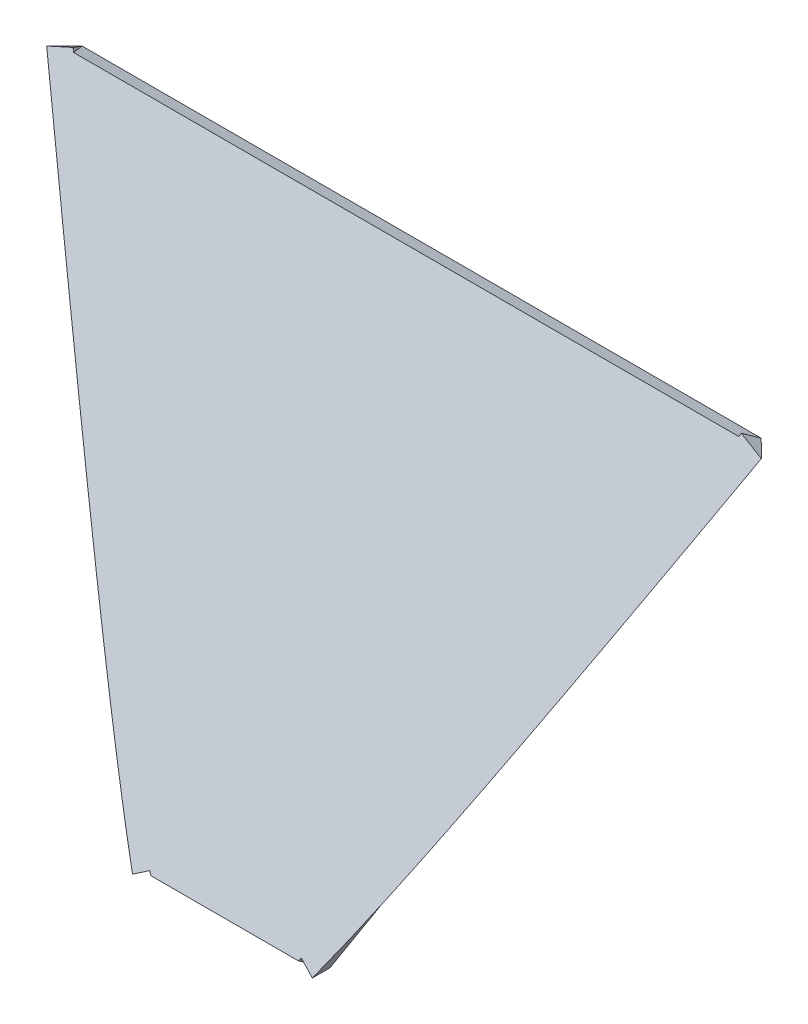
ISO-10303-21;
HEADER;
FILE_DESCRIPTION(('STEP AP214'),'2;1');
FILE_NAME('part.step','',(''),(''),'','','');
FILE_SCHEMA(('AUTOMOTIVE_DESIGN { 1 0 10303 214 1 1 1 1 }'));
ENDSEC;
DATA;
#1=APPLICATION_CONTEXT('core data for automotive mechanical design processes');
#2=APPLICATION_PROTOCOL_DEFINITION('international standard','automotive_design',2000,#1);
#3=PRODUCT_CONTEXT('',#1,'mechanical');
#4=PRODUCT('Part','Part','',(#3));
#5=PRODUCT_RELATED_PRODUCT_CATEGORY('part','',(#4));
#6=PRODUCT_DEFINITION_FORMATION('','',#4);
#7=PRODUCT_DEFINITION_CONTEXT('part definition',#1,'design');
#8=PRODUCT_DEFINITION('design','',#6,#7);
#9=PRODUCT_DEFINITION_SHAPE('','',#8);
#10=(LENGTH_UNIT() NAMED_UNIT(*) SI_UNIT(.MILLI.,.METRE.));
#11=(NAMED_UNIT(*) PLANE_ANGLE_UNIT() SI_UNIT($,.RADIAN.));
#12=(NAMED_UNIT(*) SI_UNIT($,.STERADIAN.) SOLID_ANGLE_UNIT());
#13=UNCERTAINTY_MEASURE_WITH_UNIT(LENGTH_MEASURE(1.E-05),#10,'distance_accuracy_value','');
#14=(GEOMETRIC_REPRESENTATION_CONTEXT(3) GLOBAL_UNCERTAINTY_ASSIGNED_CONTEXT((#13)) GLOBAL_UNIT_ASSIGNED_CONTEXT((#10,
#11,#12)) REPRESENTATION_CONTEXT('',''));
#15=CARTESIAN_POINT('',(0.,0.,0.));
#16=DIRECTION('',(0.,0.,1.));
#17=DIRECTION('',(1.,0.,0.));
#18=AXIS2_PLACEMENT_3D('',#15,#16,#17);
#19=CARTESIAN_POINT('',(74.944091331686,35.2889154237541,80.7341407062869));
#20=DIRECTION('',(0.,0.345802356485694,0.938307375143637));
#21=DIRECTION('',(0.,-0.938307375143637,0.345802356485694));
#22=AXIS2_PLACEMENT_3D('',#19,#20,#21);
#23=PLANE('',#22);
#24=CARTESIAN_POINT('',(-214.291058699405,361.587206260044,-39.5193294011717));
#25=CARTESIAN_POINT('',(-212.556623059235,362.245134817487,-39.7618013795339));
#26=CARTESIAN_POINT('',(-210.821546542544,362.901575988517,-40.0037251987961));
#27=CARTESIAN_POINT('',(-207.333777138551,364.217638396353,-40.4887448138685));
#28=CARTESIAN_POINT('',(-205.581072154773,364.877231409094,-40.7318302080255));
#29=CARTESIAN_POINT('',(-202.074355503818,366.193368613759,-41.2168773886066));
#30=CARTESIAN_POINT('',(-200.32034383217,366.849912795199,-41.4588391711665));
#31=CARTESIAN_POINT('',(-198.565683167573,367.504926389897,-41.7002368736433));
#32=B_SPLINE_CURVE_WITH_KNOTS('',3,(#24,#25,#26,#27,#28,#29,#30,#31),.UNSPECIFIED.,.F.,.F.,(4,2,
2,4),(0.,5.61242893117131,11.2776841921955,16.942958921563),.UNSPECIFIED.);
#33=CARTESIAN_POINT('',(-214.135561749803,361.646186737307,-39.541065975523));
#34=VERTEX_POINT('',#33);
#35=CARTESIAN_POINT('',(-198.565683191778,367.504926406604,-41.7002368798004));
#36=VERTEX_POINT('',#35);
#37=EDGE_CURVE('E134',#34,#36,#32,.T.);
#38=ORIENTED_EDGE('',*,*,#37,.F.);
#39=CARTESIAN_POINT('',(-34.9249999999667,31.4461867373069,82.1503340245001));
#40=CARTESIAN_POINT('',(-35.8161343980092,32.8686188121335,81.6261130960004));
#41=CARTESIAN_POINT('',(-36.7034870073374,34.2931331759312,81.1011247639269));
#42=CARTESIAN_POINT('',(-38.4711518673886,37.1459958902306,80.0497351282184));
#43=CARTESIAN_POINT('',(-39.351464144602,38.5743442262793,79.5233338299098));
#44=CARTESIAN_POINT('',(-41.1054973785298,41.4344231240176,78.4692847530585));
#45=CARTESIAN_POINT('',(-41.9792189356077,42.8661533616517,77.9416370939427));
#46=CARTESIAN_POINT('',(-43.7206176176778,45.7328472102319,76.885150153285));
#47=CARTESIAN_POINT('',(-44.5882947362752,47.1678108245965,76.3563108704833));
#48=CARTESIAN_POINT('',(-47.1828464425876,51.4770496144419,74.7681906364715));
#49=CARTESIAN_POINT('',(-48.9013106548347,54.3557858492935,73.707265613304));
#50=CARTESIAN_POINT('',(-52.318792562241,60.1233690543115,71.5816893721312));
#51=CARTESIAN_POINT('',(-54.0178103715098,63.0122159650194,70.5170381760386));
#52=CARTESIAN_POINT('',(-57.3985674951559,68.7980390436897,68.3847398398913));
#53=CARTESIAN_POINT('',(-59.0803102107533,71.695013462703,67.3170933443917));
#54=CARTESIAN_POINT('',(-62.4289971927276,77.4965454590095,65.1790056679063));
#55=CARTESIAN_POINT('',(-64.0959411943528,80.401103170771,64.1085644373639));
#56=CARTESIAN_POINT('',(-67.4168031450357,86.2168134329279,61.9652515245947));
#57=CARTESIAN_POINT('',(-69.0707209238514,89.1279660688754,60.8923798108388));
#58=CARTESIAN_POINT('',(-72.3670234736668,94.9560167400796,58.7445189827046));
#59=CARTESIAN_POINT('',(-74.0094082294622,97.8729147829041,57.6695298655373));
#60=CARTESIAN_POINT('',(-77.8289777223569,104.683609315012,55.1595269806653));
#61=CARTESIAN_POINT('',(-80.0021898713019,108.579367187927,53.7237903676547));
#62=CARTESIAN_POINT('',(-84.3329978142745,116.37846520867,50.8495227817017));
#63=CARTESIAN_POINT('',(-86.490593758462,120.281805283133,49.4109918357977));
#64=CARTESIAN_POINT('',(-90.7923000040815,128.095009609775,46.5315255335707));
#65=CARTESIAN_POINT('',(-92.936410334362,132.004873847976,45.0905901823995));
#66=CARTESIAN_POINT('',(-97.2130356073568,139.830474187577,42.2065554726276));
#67=CARTESIAN_POINT('',(-99.3455498508504,143.746210625288,40.7634559900831));
#68=CARTESIAN_POINT('',(-103.600328801264,151.582591264991,37.8754483250967));
#69=CARTESIAN_POINT('',(-105.722593488564,155.50323547636,36.430540139199));
#70=CARTESIAN_POINT('',(-109.958105453554,163.348812001389,33.539143436782));
#71=CARTESIAN_POINT('',(-112.071352725221,167.273744317911,32.0926549192079));
#72=CARTESIAN_POINT('',(-117.344319753221,177.090400724949,28.4748394695057));
#73=CARTESIAN_POINT('',(-120.499066838194,182.984476510885,26.3026458471654));
#74=CARTESIAN_POINT('',(-126.793573029298,194.779661374632,21.9556665639174));
#75=CARTESIAN_POINT('',(-129.933332145909,200.680770447523,19.7808809048231));
#76=CARTESIAN_POINT('',(-136.200086255644,212.488752872153,15.4291852281761));
#77=CARTESIAN_POINT('',(-139.327081590411,218.395626064292,13.2522752694418));
#78=CARTESIAN_POINT('',(-145.570257574136,230.214401869949,8.89660181675647));
#79=CARTESIAN_POINT('',(-148.686438221582,236.126304484168,6.71783832254634));
#80=CARTESIAN_POINT('',(-155.287508588989,248.672878800864,2.09394312629235));
#81=CARTESIAN_POINT('',(-158.771200720539,255.308105165093,-0.351392989940294));
#82=CARTESIAN_POINT('',(-165.728642914917,268.58314732508,-5.24375660444115));
#83=CARTESIAN_POINT('',(-169.202392974276,275.222963122439,-7.69078410329906));
#84=CARTESIAN_POINT('',(-176.141364788868,288.506521255139,-12.5862861812822));
#85=CARTESIAN_POINT('',(-179.606586539061,295.150263592799,-15.0347607612617));
#86=CARTESIAN_POINT('',(-186.529758566307,308.441322686411,-19.9330272318392));
#87=CARTESIAN_POINT('',(-189.987708628333,315.088639540964,-22.3828191587751));
#88=CARTESIAN_POINT('',(-196.89720022902,328.386198514643,-27.2834810851527));
#89=CARTESIAN_POINT('',(-200.348741772402,335.03644063161,-29.7343510837987));
#90=CARTESIAN_POINT('',(-207.246185769041,348.33948210226,-34.6370335211752));
#91=CARTESIAN_POINT('',(-210.692088233971,354.992281450614,-37.0888459579421));
#92=CARTESIAN_POINT('',(-214.135561749803,361.646186737307,-39.541065975523));
#93=B_SPLINE_CURVE_WITH_KNOTS('',3,(#39,#40,#41,#42,#43,#44,#45,#46,#47,#48,#49,#50,#51,#52,#53,
#54,#55,#56,#57,#58,#59,#60,#61,#62,#63,#64,#65,#66,#67,#68,#69,#70,#71,#72,#73,#74,#75,#76,#77,
#78,#79,#80,#81,#82,#83,#84,#85,#86,#87,#88,#89,#90,#91,#92),.UNSPECIFIED.,.F.,.F.,(4,2,2,2,2,2,
2,2,2,2,2,2,2,2,2,2,2,2,2,2,2,2,2,2,2,2,4),(0.,5.27542039554755,10.5508209321397,
15.8257349724095,21.100654592352,31.65007673398,42.199436940909,52.7466787067421,
63.2941087859819,73.8416764835306,84.3892580835579,98.4480251037841,112.506656759865,
126.565258331374,140.624698411413,154.68416539385,168.743641765087,189.831499844345,
210.919343178543,232.006618313265,253.093896395909,276.742947803836,300.392007461179,
324.041081093033,347.690844473128,371.340590425955,394.990287363322),.UNSPECIFIED.);
#94=CARTESIAN_POINT('',(-34.9249999999667,31.4461867373068,82.1503340245));
#95=VERTEX_POINT('',#94);
#96=EDGE_CURVE('E104',#95,#34,#93,.T.);
#97=ORIENTED_EDGE('',*,*,#96,.F.);
#98=CARTESIAN_POINT('',(-25.4167633634859,37.1982689160908,80.0304705079133));
#99=CARTESIAN_POINT('',(-26.2249734203033,36.7260691079059,80.2044942986366));
#100=CARTESIAN_POINT('',(-27.0312156269518,36.2508972707466,80.3796133964021));
#101=CARTESIAN_POINT('',(-29.0419425011907,35.055397105737,80.8202011878992));
#102=CARTESIAN_POINT('',(-30.2439047070923,34.3313303642616,81.0870476308791));
#103=CARTESIAN_POINT('',(-32.6385922877383,32.8695189744457,81.6257813515922));
#104=CARTESIAN_POINT('',(-33.8313162959501,32.1317723553333,81.8976693556305));
#105=CARTESIAN_POINT('',(-35.0191676369837,31.3871796363818,82.1720804106949));
#106=B_SPLINE_CURVE_WITH_KNOTS('',3,(#98,#99,#100,#101,#102,#103,#104,#105),.UNSPECIFIED.,.F.,
.F.,(4,2,2,4),(0.,2.85624777881735,7.14120124719607,11.4267768924569),.UNSPECIFIED.);
#107=CARTESIAN_POINT('',(-25.4173149649188,37.1987150096691,80.0303061050468));
#108=VERTEX_POINT('',#107);
#109=EDGE_CURVE('E63',#108,#95,#106,.T.);
#110=ORIENTED_EDGE('',*,*,#109,.F.);
#111=CARTESIAN_POINT('',(-24.2574045943366,35.2889154237542,80.7341407062869));
#112=CARTESIAN_POINT('',(-24.645173966298,35.9249175390839,80.499749465168));
#113=CARTESIAN_POINT('',(-25.0317912514901,36.5615276952786,80.265134137604));
#114=CARTESIAN_POINT('',(-25.4173149649188,37.1987150096691,80.0303061050466));
#115=B_SPLINE_CURVE_WITH_KNOTS('',3,(#111,#112,#113,#114),.UNSPECIFIED.,.F.,.F.,(4,4),(0.,1.),.UNSPECIFIED.);
#116=CARTESIAN_POINT('',(-24.2574045943365,35.2889154237541,80.7341407062869));
#117=VERTEX_POINT('',#116);
#118=EDGE_CURVE('E464',#108,#117,#115,.F.);
#119=ORIENTED_EDGE('',*,*,#118,.T.);
#120=DIRECTION('',(1.,0.,0.));
#121=VECTOR('',#120,1.);
#122=CARTESIAN_POINT('',(0.,35.2889154237541,80.7341407062869));
#123=LINE('',#122,#121);
#124=CARTESIAN_POINT('',(74.944091331686,35.2889154237541,80.7341407062869));
#125=VERTEX_POINT('',#124);
#126=EDGE_CURVE('E54',#125,#117,#123,.F.);
#127=ORIENTED_EDGE('',*,*,#126,.F.);
#128=CARTESIAN_POINT('',(76.1040017022596,37.1987150096687,80.030306105047));
#129=CARTESIAN_POINT('',(75.7184787465366,36.5615289476017,80.2651336760749));
#130=CARTESIAN_POINT('',(75.3318614791169,35.924918810988,80.4997489964223));
#131=CARTESIAN_POINT('',(74.9440913316797,35.2889154237573,80.7341407062856));
#132=B_SPLINE_CURVE_WITH_KNOTS('',3,(#128,#129,#130,#131),.UNSPECIFIED.,.F.,.F.,(4,4),(0.,1.),.UNSPECIFIED.);
#133=CARTESIAN_POINT('',(76.1040017022596,37.1987150096687,80.030306105047));
#134=VERTEX_POINT('',#133);
#135=EDGE_CURVE('E426',#125,#134,#132,.F.);
#136=ORIENTED_EDGE('',*,*,#135,.T.);
#137=CARTESIAN_POINT('',(85.7058543743247,31.3871796363817,82.1720804106949));
#138=CARTESIAN_POINT('',(84.1224380818157,32.3797290347107,81.8062877824337));
#139=CARTESIAN_POINT('',(82.5303882104285,33.3600975763007,81.4449842683754));
#140=CARTESIAN_POINT('',(80.1297353980894,34.8127193997116,80.9096372563783));
#141=CARTESIAN_POINT('',(79.3273265073177,35.293993630977,80.7322691916096));
#142=CARTESIAN_POINT('',(77.7184195373228,36.2505922827194,80.3797257961866));
#143=CARTESIAN_POINT('',(76.911921203621,36.7259163263811,80.2045506044033));
#144=CARTESIAN_POINT('',(76.1034501008773,37.1982689160922,80.0304705076874));
#145=B_SPLINE_CURVE_WITH_KNOTS('',3,(#137,#138,#139,#140,#141,#142,#143,#144),.UNSPECIFIED.,.F.,
.F.,(4,2,2,4),(0.,5.71261853304421,8.56959877485043,11.4267590382404),.UNSPECIFIED.);
#146=CARTESIAN_POINT('',(85.6116867373077,31.4461867373069,82.1503340245001));
#147=VERTEX_POINT('',#146);
#148=EDGE_CURVE('E249',#147,#134,#145,.T.);
#149=ORIENTED_EDGE('',*,*,#148,.F.);
#150=CARTESIAN_POINT('',(264.822248487125,361.646186737307,-39.541065975523));
#151=CARTESIAN_POINT('',(262.373235030696,356.913874369026,-37.7970268557971));
#152=CARTESIAN_POINT('',(259.922981382809,352.182126886898,-36.0531959183447));
#153=CARTESIAN_POINT('',(255.019729314052,342.719875570894,-32.5659923756537));
#154=CARTESIAN_POINT('',(252.566730889145,337.989371738861,-30.8226197710939));
#155=CARTESIAN_POINT('',(247.657730081595,328.529731671788,-27.3363785740669));
#156=CARTESIAN_POINT('',(245.201727696497,323.800595437872,-25.593509982013));
#157=CARTESIAN_POINT('',(240.286415579508,314.343834829569,-22.1083299762911));
#158=CARTESIAN_POINT('',(237.82710584674,309.616210455585,-20.3660185627707));
#159=CARTESIAN_POINT('',(232.904779087827,300.162527368939,-16.8819727421456));
#160=CARTESIAN_POINT('',(230.441761978299,295.4364686945,-15.1402383491269));
#161=CARTESIAN_POINT('',(225.511682913912,285.986211002676,-11.6574549182394));
#162=CARTESIAN_POINT('',(223.04462096041,281.262011984668,-9.91640588014084));
#163=CARTESIAN_POINT('',(218.10600000492,271.815685803353,-6.43507136208805));
#164=CARTESIAN_POINT('',(215.634441004546,267.093558639305,-4.6947858818603));
#165=CARTESIAN_POINT('',(210.686302169145,257.651621478732,-1.21506888675941));
#166=CARTESIAN_POINT('',(208.209722334713,252.931811481934,0.524362628214786));
#167=CARTESIAN_POINT('',(202.532530404418,242.127591428318,4.50613326489828));
#168=CARTESIAN_POINT('',(199.330053209612,236.044043981929,6.74815448148697));
#169=CARTESIAN_POINT('',(192.914202719907,223.882006177796,11.2303331829957));
#170=CARTESIAN_POINT('',(189.700829421322,217.803515821763,13.4704906672848));
#171=CARTESIAN_POINT('',(183.26127730422,205.652496627513,17.948608587259));
#172=CARTESIAN_POINT('',(180.035098465802,199.579967798579,20.1865690195228));
#173=CARTESIAN_POINT('',(173.56754609844,187.441971742167,24.6598874123133));
#174=CARTESIAN_POINT('',(170.326172441834,181.376504574556,26.8952453507773));
#175=CARTESIAN_POINT('',(163.82527775981,169.254144095241,31.3628014320395));
#176=CARTESIAN_POINT('',(160.565756754559,163.197250774018,33.5949995783461));
#177=CARTESIAN_POINT('',(154.02478284532,151.093905613992,38.0555477830919));
#178=CARTESIAN_POINT('',(150.743329985624,145.047453754132,40.2838978492914));
#179=CARTESIAN_POINT('',(145.800194629116,135.986024820334,43.6233829278942));
#180=CARTESIAN_POINT('',(144.148593960454,132.96620444386,44.7363028835624));
#181=CARTESIAN_POINT('',(140.837888982458,126.930188759159,46.9608068178245));
#182=CARTESIAN_POINT('',(139.178784678376,123.913993448397,48.0723907973528));
#183=CARTESIAN_POINT('',(135.852208511641,117.885671534372,50.2940592812066));
#184=CARTESIAN_POINT('',(134.184736658371,114.873544926552,51.4041437872118));
#185=CARTESIAN_POINT('',(130.840500914025,108.854028900133,53.6225669627947));
#186=CARTESIAN_POINT('',(129.163737497,105.846639249729,54.7309057178014));
#187=CARTESIAN_POINT('',(125.799664225356,99.8370508328999,56.9456701874195));
#188=CARTESIAN_POINT('',(124.112354355776,96.8348520738456,58.0520958993142));
#189=CARTESIAN_POINT('',(120.725817307768,90.8363518533535,60.2627739421129));
#190=CARTESIAN_POINT('',(119.026590057498,87.8400504276063,61.3670262598635));
#191=CARTESIAN_POINT('',(116.040376849669,82.6011552716868,63.2977606207877));
#192=CARTESIAN_POINT('',(114.756342405985,80.3570803089992,64.1247885551138));
#193=CARTESIAN_POINT('',(112.179877930539,75.8731781523473,65.7772789576156));
#194=CARTESIAN_POINT('',(110.887447904514,73.6333509554814,66.6027414268607));
#195=CARTESIAN_POINT('',(108.293315420009,69.1584516412328,68.2519139356737));
#196=CARTESIAN_POINT('',(106.991613038425,66.9233794846154,69.0756239897011));
#197=CARTESIAN_POINT('',(104.377928033323,62.4585638938448,70.7210802585769));
#198=CARTESIAN_POINT('',(103.065945524043,60.2288204008348,71.5428264951164));
#199=CARTESIAN_POINT('',(100.430317960587,55.7749368355772,73.1842538921282));
#200=CARTESIAN_POINT('',(99.106671058902,53.5507977254411,74.0039346980254));
#201=CARTESIAN_POINT('',(96.4465930364764,49.1092457658573,75.6408174240539));
#202=CARTESIAN_POINT('',(95.1101618620855,46.8918329446887,76.4580193337632));
#203=CARTESIAN_POINT('',(92.4229658123994,42.4645906897259,78.0896283832655));
#204=CARTESIAN_POINT('',(91.0722005990866,40.2547614363967,78.9040354565503));
#205=CARTESIAN_POINT('',(89.0339700074727,36.9464916715137,80.1232601060547));
#206=CARTESIAN_POINT('',(88.3525264437492,35.8447828312743,80.5292821871));
#207=CARTESIAN_POINT('',(86.9853707422857,33.6436968457329,81.3404670299254));
#208=CARTESIAN_POINT('',(86.2996585964733,32.5443197048456,81.7456297900787));
#209=CARTESIAN_POINT('',(85.6116867373077,31.4461867373068,82.1503340245001));
#210=B_SPLINE_CURVE_WITH_KNOTS('',3,(#150,#151,#152,#153,#154,#155,#156,#157,#158,#159,#160,
#161,#162,#163,#164,#165,#166,#167,#168,#169,#170,#171,#172,#173,#174,#175,#176,#177,#178,#179,
#180,#181,#182,#183,#184,#185,#186,#187,#188,#189,#190,#191,#192,#193,#194,#195,#196,#197,#198,
#199,#200,#201,#202,#203,#204,#205,#206,#207,#208,#209),.UNSPECIFIED.,.F.,.F.,(4,2,2,2,2,2,2,2,
2,2,2,2,2,2,2,2,2,2,2,2,2,2,2,2,2,2,2,2,2,4),(0.,16.8198418586064,33.6397084913089,
50.4595888807314,67.2794737277855,84.0997426984946,100.920006025401,117.740263322297,
134.560518628115,156.25448628729,177.948461287201,199.642470014921,221.33666133405,
243.030828547191,264.724951959978,275.577188769536,286.429417984416,297.281635031943,
308.133303410332,318.984987186143,329.836736435464,337.980267157152,346.123792313964,
354.267250014494,362.410617348606,370.555298551796,378.700013949918,386.844921841026,
390.917607674481,394.990301212203),.UNSPECIFIED.);
#211=CARTESIAN_POINT('',(264.822248487125,361.646186737307,-39.5410659755228));
#212=VERTEX_POINT('',#211);
#213=EDGE_CURVE('E129',#212,#147,#210,.T.);
#214=ORIENTED_EDGE('',*,*,#213,.F.);
#215=CARTESIAN_POINT('',(249.252369904895,367.504926389897,-41.7002368736432));
#216=CARTESIAN_POINT('',(250.990663060656,366.85602277472,-41.4610909336192));
#217=CARTESIAN_POINT('',(252.728319277126,366.205616993418,-41.2213913876025));
#218=CARTESIAN_POINT('',(256.218704699571,364.895674929714,-40.7386273547402));
#219=CARTESIAN_POINT('',(257.971421834232,364.236110328901,-40.4955524314713));
#220=CARTESIAN_POINT('',(261.475558794488,362.913937755393,-40.0082809853425));
#221=CARTESIAN_POINT('',(263.22697861562,362.251329772283,-39.764084458644));
#222=CARTESIAN_POINT('',(264.977745436727,361.587206260044,-39.5193294011717));
#223=B_SPLINE_CURVE_WITH_KNOTS('',3,(#215,#216,#217,#218,#219,#220,#221,#222),.UNSPECIFIED.,.F.,
.F.,(4,2,2,4),(0.,5.61242895938073,11.2776842391149,16.9429589217156),.UNSPECIFIED.);
#224=CARTESIAN_POINT('',(249.2523699291,367.504926406603,-41.7002368798003));
#225=VERTEX_POINT('',#224);
#226=EDGE_CURVE('E250',#225,#212,#223,.T.);
#227=ORIENTED_EDGE('',*,*,#226,.F.);
#228=CARTESIAN_POINT('',(248.225430882982,365.488915423754,-40.9572592937362));
#229=DIRECTION('',(0.431238885415007,0.846576369371373,-0.311995952742991));
#230=VECTOR('',#229,1.);
#231=LINE('',#228,#230);
#232=CARTESIAN_POINT('',(248.225430882982,365.488915423754,-40.9572592937363));
#233=VERTEX_POINT('',#232);
#234=EDGE_CURVE('E153',#233,#225,#231,.T.);
#235=ORIENTED_EDGE('',*,*,#234,.F.);
#236=DIRECTION('',(1.,0.,0.));
#237=VECTOR('',#236,1.);
#238=CARTESIAN_POINT('',(0.,365.488915423754,-40.9572592937362));
#239=LINE('',#238,#237);
#240=CARTESIAN_POINT('',(-197.538744145659,365.488915423754,-40.9572592937362));
#241=VERTEX_POINT('',#240);
#242=EDGE_CURVE('E11',#233,#241,#239,.F.);
#243=ORIENTED_EDGE('',*,*,#242,.T.);
#244=CARTESIAN_POINT('',(-198.565683191778,367.504926406604,-41.7002368798004));
#245=DIRECTION('',(0.431238885415041,-0.846576369371351,0.311995952743004));
#246=VECTOR('',#245,1.);
#247=LINE('',#244,#246);
#248=EDGE_CURVE('E122',#36,#241,#247,.T.);
#249=ORIENTED_EDGE('',*,*,#248,.F.);
#250=EDGE_LOOP('',(#38,#97,#110,#119,#127,#136,#149,#214,#227,#235,#243,#249));
#251=FACE_BOUND('',#250,.T.);
#252=ADVANCED_FACE('F39',(#251),#23,.T.);
#253=CARTESIAN_POINT('',(-297.73351409703,361.583707070747,43.3936114019423));
#254=CARTESIAN_POINT('',(-265.916659572022,361.58499252846,11.7786580540092));
#255=CARTESIAN_POINT('',(-234.09980366564,361.586333054343,-19.8362939036235));
#256=CARTESIAN_POINT('',(-202.282942677506,361.587731212742,-51.4512407467071));
#257=CARTESIAN_POINT('',(-201.964774067624,361.587745194326,-51.7673902151379));
#258=CARTESIAN_POINT('',(-201.646605457743,361.58775917591,-52.0835396835688));
#259=CARTESIAN_POINT('',(-201.328436847862,361.587773157494,-52.3996891519996));
#260=CARTESIAN_POINT('',(-297.668741542232,361.646186737307,43.4588001512513));
#261=CARTESIAN_POINT('',(-265.851271011261,361.646186737307,11.8444667674944));
#262=CARTESIAN_POINT('',(-234.03380048029,361.646186737307,-19.769866616263));
#263=CARTESIAN_POINT('',(-202.216329949319,361.646186737307,-51.3842000000199));
#264=CARTESIAN_POINT('',(-201.898155244009,361.646186737307,-51.7003433338574));
#265=CARTESIAN_POINT('',(-201.5799805387,361.646186737307,-52.016486667695));
#266=CARTESIAN_POINT('',(-201.26180583339,361.646186737307,-52.3326300015326));
#267=CARTESIAN_POINT('',(-291.191486062361,367.894153393254,49.9776750821469));
#268=CARTESIAN_POINT('',(-259.312414935143,367.76560762204,18.4253381160208));
#269=CARTESIAN_POINT('',(-227.433481945308,367.631555033677,-13.1271378802075));
#270=CARTESIAN_POINT('',(-195.555057130655,367.491739193792,-44.6801253312971));
#271=CARTESIAN_POINT('',(-195.236272882508,367.490341035393,-44.995655205808));
#272=CARTESIAN_POINT('',(-194.917488634362,367.488942876994,-45.3111850803189));
#273=CARTESIAN_POINT('',(-194.598704386215,367.487544718595,-45.6267149548298));
#274=B_SPLINE_SURFACE_WITH_KNOTS('',1,3,((#253,#254,#255,#256,#257,#258,#259),(#260,#261,#262,
#263,#264,#265,#266),(#267,#268,#269,#270,#271,#272,#273)),.UNSPECIFIED.,.F.,.F.,.F.,(2,1,2),(4,
3,4),(-0.01,0.,1.),(-0.0672799330346664,0.0672799330346665,0.0686255316953598),.UNSPECIFIED.);
#275=CARTESIAN_POINT('',(-297.668741542232,361.646186737307,43.4588001512512));
#276=CARTESIAN_POINT('',(-281.760006276746,361.646186737307,27.6516334593727));
#277=CARTESIAN_POINT('',(-265.851271011261,361.646186737307,11.8444667674942));
#278=CARTESIAN_POINT('',(-234.03380048029,361.646186737307,-19.7698666162628));
#279=CARTESIAN_POINT('',(-218.125065214804,361.646186737307,-35.5770333081413));
#280=CARTESIAN_POINT('',(-202.216329949319,361.646186737307,-51.3842000000199));
#281=B_SPLINE_CURVE_WITH_KNOTS('',3,(#275,#276,#277,#278,#279,#280),.UNSPECIFIED.,.F.,.F.,(4,2,
4),(0.,0.5,1.),.UNSPECIFIED.);
#282=CARTESIAN_POINT('',(-202.216329949319,361.646186737307,-51.3842000000199));
#283=VERTEX_POINT('',#282);
#284=EDGE_CURVE('E96',#34,#283,#281,.T.);
#285=CARTESIAN_POINT('',(-198.56568318051,367.504926385377,-41.700236871165));
#286=CARTESIAN_POINT('',(-198.717553237024,367.260263553162,-42.1034938854414));
#287=CARTESIAN_POINT('',(-198.869453315107,367.015669200057,-42.5067811407913));
#288=CARTESIAN_POINT('',(-199.173313476408,366.526617570929,-43.313416042178));
#289=CARTESIAN_POINT('',(-199.325273559616,366.282160294879,-43.7167636882036));
#290=CARTESIAN_POINT('',(-199.629253725417,365.793382886684,-44.5235193651574));
#291=CARTESIAN_POINT('',(-199.781273808001,365.549062754517,-44.926927396076));
#292=CARTESIAN_POINT('',(-200.085373966773,365.060559700929,-45.7338038369965));
#293=CARTESIAN_POINT('',(-200.237454042954,364.81637677949,-46.1372722469904));
#294=CARTESIAN_POINT('',(-200.54167418312,364.328148214214,-46.9442694402235));
#295=CARTESIAN_POINT('',(-200.693814247098,364.084102570363,-47.3477982234561));
#296=CARTESIAN_POINT('',(-200.998154357033,363.596148627137,-48.1549161573037));
#297=CARTESIAN_POINT('',(-201.150354402985,363.352240327751,-48.5585053079138));
#298=CARTESIAN_POINT('',(-201.454814471023,362.864561140342,-49.3657439706344));
#299=CARTESIAN_POINT('',(-201.607074493106,362.620790252312,-49.7693934827417));
#300=CARTESIAN_POINT('',(-201.911654507529,362.133385954521,-50.5767528625398));
#301=CARTESIAN_POINT('',(-202.063974499868,361.889752544756,-50.980462730229));
#302=CARTESIAN_POINT('',(-202.216324474403,361.646187907582,-51.3842027727637));
#303=B_SPLINE_CURVE_WITH_KNOTS('',3,(#285,#286,#287,#288,#289,#290,#291,#292,#293,#294,#295,
#296,#297,#298,#299,#300,#301,#302),.UNSPECIFIED.,.F.,.F.,(4,2,2,2,2,2,2,2,4),(0.,
1.48656170286711,2.97312312917444,4.45968431826537,5.94624530953776,7.43280614244419,
8.91936685649186,10.4059274912428,11.8924880863139),.UNSPECIFIED.);
#304=EDGE_CURVE('E119',#36,#283,#303,.T.);
#305=ORIENTED_EDGE('',*,*,#284,.F.);
#306=ORIENTED_EDGE('',*,*,#37,.T.);
#307=ORIENTED_EDGE('',*,*,#304,.T.);
#308=EDGE_LOOP('',(#305,#306,#307));
#309=FACE_BOUND('',#308,.T.);
#310=ADVANCED_FACE('F133',(#309),#274,.T.);
#311=CARTESIAN_POINT('',(-35.0241286863038,31.3959645393255,70.3072000000032));
#312=CARTESIAN_POINT('',(-35.0202777592816,31.3883635709842,79.8282122567529));
#313=CARTESIAN_POINT('',(-35.0160380597837,31.3821256341456,89.3492268798435));
#314=CARTESIAN_POINT('',(-35.0119556806026,31.3769951537859,98.8702406093947));
#315=CARTESIAN_POINT('',(-34.9249999999667,31.4461867373069,70.3072000000032));
#316=CARTESIAN_POINT('',(-34.9249999999667,31.4461867373069,79.828213536467));
#317=CARTESIAN_POINT('',(-34.9249999999667,31.4461867373069,89.3492270729309));
#318=CARTESIAN_POINT('',(-34.9249999999667,31.4461867373069,98.8702406093947));
#319=CARTESIAN_POINT('',(-25.0121313662584,36.4684065354482,70.3072000000032));
#320=CARTESIAN_POINT('',(-25.3972240684742,37.2285033695766,79.8283415078825));
#321=CARTESIAN_POINT('',(-25.8211940182613,37.8522970534396,89.3492463816683));
#322=CARTESIAN_POINT('',(-26.2294319363748,38.3653450894073,98.8702406093947));
#323=B_SPLINE_SURFACE_WITH_KNOTS('',1,3,((#311,#312,#313,#314),(#315,#316,#317,#318),(#319,#320,
#321,#322)),.UNSPECIFIED.,.F.,.F.,.F.,(2,1,2),(4,4),(-0.01,0.,1.),(-0.0142815203046956,
0.0142815203046959),.UNSPECIFIED.);
#324=CARTESIAN_POINT('',(-25.4170338814331,37.198103329077,80.030450378742));
#325=CARTESIAN_POINT('',(-25.808435550226,36.9221534894681,79.6230548889201));
#326=CARTESIAN_POINT('',(-26.2015409576131,36.649925000224,79.2147719052721));
#327=CARTESIAN_POINT('',(-26.9886358385819,36.1148186237209,78.3990897656102));
#328=CARTESIAN_POINT('',(-27.3826036710575,35.8518921608733,77.9917015894288));
#329=CARTESIAN_POINT('',(-28.1714307674649,35.3353851865718,77.1778102595163));
#330=CARTESIAN_POINT('',(-28.5662692036675,35.0817566724946,76.7713173917852));
#331=CARTESIAN_POINT('',(-29.3568426350953,34.5838417999604,75.9592188382035));
#332=CARTESIAN_POINT('',(-29.7525576483979,34.3395080883138,75.5536227386762));
#333=CARTESIAN_POINT('',(-30.5448888372715,33.8601792911401,74.7433193857038));
#334=CARTESIAN_POINT('',(-30.9414858960325,33.6251375838875,74.3386210244388));
#335=CARTESIAN_POINT('',(-31.7355846464918,33.1643896747122,73.530114791274));
#336=CARTESIAN_POINT('',(-32.1330681068587,32.9386376653428,73.1263151224155));
#337=CARTESIAN_POINT('',(-32.9289426424463,32.4964664952949,72.3196074158657));
#338=CARTESIAN_POINT('',(-33.3273163857069,32.2800024253759,71.9167069022399));
#339=CARTESIAN_POINT('',(-34.1249719571365,31.8564046164816,71.111799556196));
#340=CARTESIAN_POINT('',(-34.5242373747453,31.6492269533315,70.7097995737596));
#341=CARTESIAN_POINT('',(-34.9250000240427,31.4461867251092,70.3072000301209));
#342=B_SPLINE_CURVE_WITH_KNOTS('',3,(#324,#325,#326,#327,#328,#329,#330,#331,#332,#333,#334,
#335,#336,#337,#338,#339,#340,#341),.UNSPECIFIED.,.F.,.F.,(4,2,2,2,2,2,2,2,4),(0.,
1.88621113845238,3.76038836364706,5.6228949339418,7.47409869955591,9.31437202016739,
11.1440916786513,12.9636387906842,14.7733987099566),.UNSPECIFIED.);
#343=CARTESIAN_POINT('',(-34.9249999999667,31.4461867373069,70.3072000000032));
#344=VERTEX_POINT('',#343);
#345=EDGE_CURVE('E466',#108,#344,#342,.T.);
#346=CARTESIAN_POINT('',(-34.9249999999667,31.4461867373069,70.3072000000032));
#347=CARTESIAN_POINT('',(-34.9249999999667,31.4461867373069,75.067706768235));
#348=CARTESIAN_POINT('',(-34.9249999999667,31.4461867373069,79.8282135364669));
#349=CARTESIAN_POINT('',(-34.9249999999667,31.4461867373069,89.3492270729307));
#350=CARTESIAN_POINT('',(-34.9249999999667,31.4461867373069,94.1097338411627));
#351=CARTESIAN_POINT('',(-34.9249999999667,31.4461867373069,98.8702406093947));
#352=B_SPLINE_CURVE_WITH_KNOTS('',3,(#346,#347,#348,#349,#350,#351),.UNSPECIFIED.,.F.,.F.,(4,2,
4),(0.,0.5,1.),.UNSPECIFIED.);
#353=EDGE_CURVE('E110',#344,#95,#352,.T.);
#354=ORIENTED_EDGE('',*,*,#345,.F.);
#355=ORIENTED_EDGE('',*,*,#109,.T.);
#356=ORIENTED_EDGE('',*,*,#353,.F.);
#357=EDGE_LOOP('',(#354,#355,#356));
#358=FACE_BOUND('',#357,.T.);
#359=ADVANCED_FACE('F189',(#358),#323,.T.);
#360=CARTESIAN_POINT('',(0.,344.973611812309,-45.2397148872752));
#361=DIRECTION('',(0.,0.345802356485694,0.938307375143637));
#362=DIRECTION('',(0.,-0.938307375143637,0.345802356485694));
#363=AXIS2_PLACEMENT_3D('',#360,#361,#362);
#364=PLANE('',#363);
#365=DIRECTION('',(0.429337284686036,-0.847426889643648,0.312309402175653));
#366=VECTOR('',#365,1.);
#367=CARTESIAN_POINT('',(-118.570664974643,196.546186737307,9.46149999999166));
#368=LINE('',#367,#366);
#369=EDGE_CURVE('E102',#283,#344,#368,.T.);
#370=ORIENTED_EDGE('',*,*,#369,.F.);
#371=DIRECTION('',(-1.,0.,0.));
#372=VECTOR('',#371,1.);
#373=CARTESIAN_POINT('',(252.903016686641,361.646186737307,-51.3842000000199));
#374=LINE('',#373,#372);
#375=CARTESIAN_POINT('',(252.903016686641,361.646186737307,-51.3842000000199));
#376=VERTEX_POINT('',#375);
#377=EDGE_CURVE('E140',#376,#283,#374,.T.);
#378=ORIENTED_EDGE('',*,*,#377,.F.);
#379=DIRECTION('',(0.429337284685996,0.847426889643666,-0.31230940217566));
#380=VECTOR('',#379,1.);
#381=CARTESIAN_POINT('',(169.257351711974,196.546186737307,9.46149999999164));
#382=LINE('',#381,#380);
#383=CARTESIAN_POINT('',(85.6116867373077,31.4461867373069,70.3072000000032));
#384=VERTEX_POINT('',#383);
#385=EDGE_CURVE('E436',#384,#376,#382,.T.);
#386=ORIENTED_EDGE('',*,*,#385,.F.);
#387=DIRECTION('',(-1.,0.,0.));
#388=VECTOR('',#387,1.);
#389=CARTESIAN_POINT('',(-34.9249999999667,31.4461867373069,70.3072000000032));
#390=LINE('',#389,#388);
#391=EDGE_CURVE('E148',#384,#344,#390,.T.);
#392=ORIENTED_EDGE('',*,*,#391,.T.);
#393=EDGE_LOOP('',(#370,#378,#386,#392));
#394=FACE_BOUND('',#393,.T.);
#395=ADVANCED_FACE('F151',(#394),#364,.F.);
#396=CARTESIAN_POINT('',(249.2523699291,367.504926406603,-41.7002368798003));
#397=DIRECTION('',(0.843459103537497,-0.255501074852022,0.472541999624567));
#398=DIRECTION('',(-0.222903136472021,-0.96680877155178,-0.124879906315925));
#399=AXIS2_PLACEMENT_3D('',#396,#397,#398);
#400=PLANE('',#399);
#401=CARTESIAN_POINT('',(248.225430882982,365.488915423754,-40.9572592937362));
#402=DIRECTION('',(0.387961074909248,-0.318717649307973,-0.864815161970962));
#403=VECTOR('',#402,1.);
#404=LINE('',#401,#403);
#405=EDGE_CURVE('E128',#233,#376,#404,.T.);
#406=ORIENTED_EDGE('',*,*,#405,.F.);
#407=ORIENTED_EDGE('',*,*,#234,.T.);
#408=CARTESIAN_POINT('',(252.903011211725,361.646187907582,-51.3842027727637));
#409=CARTESIAN_POINT('',(252.75066123719,361.889752544756,-50.980462730229));
#410=CARTESIAN_POINT('',(252.598341244851,362.133385954521,-50.5767528625397));
#411=CARTESIAN_POINT('',(252.293761230428,362.620790252312,-49.7693934827416));
#412=CARTESIAN_POINT('',(252.141501208345,362.864561140342,-49.3657439706344));
#413=CARTESIAN_POINT('',(251.837041140307,363.352240327751,-48.5585053079138));
#414=CARTESIAN_POINT('',(251.684841094355,363.596148627137,-48.1549161573037));
#415=CARTESIAN_POINT('',(251.38050098442,364.084102570363,-47.347798223456));
#416=CARTESIAN_POINT('',(251.228360920442,364.328148214214,-46.9442694402234));
#417=CARTESIAN_POINT('',(250.924140780276,364.816376779489,-46.1372722469904));
#418=CARTESIAN_POINT('',(250.772060704095,365.060559700929,-45.7338038369964));
#419=CARTESIAN_POINT('',(250.467960545323,365.549062754517,-44.9269273960759));
#420=CARTESIAN_POINT('',(250.315940462739,365.793382886684,-44.5235193651574));
#421=CARTESIAN_POINT('',(250.011960296938,366.282160294879,-43.7167636882036));
#422=CARTESIAN_POINT('',(249.86000021373,366.526617570929,-43.3134160421779));
#423=CARTESIAN_POINT('',(249.556140052428,367.015669200057,-42.5067811407912));
#424=CARTESIAN_POINT('',(249.404239974345,367.260263553162,-42.1034938854414));
#425=CARTESIAN_POINT('',(249.252369917832,367.504926385377,-41.700236871165));
#426=B_SPLINE_CURVE_WITH_KNOTS('',3,(#408,#409,#410,#411,#412,#413,#414,#415,#416,#417,#418,
#419,#420,#421,#422,#423,#424,#425),.UNSPECIFIED.,.F.,.F.,(4,2,2,2,2,2,2,2,4),(0.,
1.48656059507106,2.97312122982211,4.45968194386982,5.94624277677627,7.43280376804866,
8.91936495713957,10.4059263834469,11.8924880863141),.UNSPECIFIED.);
#427=EDGE_CURVE('E136',#225,#376,#426,.F.);
#428=ORIENTED_EDGE('',*,*,#427,.T.);
#429=EDGE_LOOP('',(#406,#407,#428));
#430=FACE_BOUND('',#429,.T.);
#431=ADVANCED_FACE('F327',(#430),#400,.F.);
#432=CARTESIAN_POINT('',(-197.538744145659,365.488915423754,-40.9572592937362));
#433=DIRECTION('',(-0.843459103537485,-0.255501074852039,0.472541999624579));
#434=DIRECTION('',(0.222903136472034,-0.966808771551775,-0.124879906315937));
#435=AXIS2_PLACEMENT_3D('',#432,#433,#434);
#436=PLANE('',#435);
#437=ORIENTED_EDGE('',*,*,#248,.T.);
#438=CARTESIAN_POINT('',(-197.538744145659,365.488915423754,-40.9572592937362));
#439=DIRECTION('',(-0.387960639279979,-0.318717517346952,-0.864815406029324));
#440=VECTOR('',#439,1.);
#441=LINE('',#438,#440);
#442=EDGE_CURVE('E116',#241,#283,#441,.T.);
#443=ORIENTED_EDGE('',*,*,#442,.T.);
#444=ORIENTED_EDGE('',*,*,#304,.F.);
#445=EDGE_LOOP('',(#437,#443,#444));
#446=FACE_BOUND('',#445,.T.);
#447=ADVANCED_FACE('F118',(#446),#436,.F.);
#448=CARTESIAN_POINT('',(252.903016686641,361.646186737307,-51.3842000000199));
#449=DIRECTION('',(0.,0.938307375143637,-0.345802356485694));
#450=DIRECTION('',(-1.,0.,0.));
#451=AXIS2_PLACEMENT_3D('',#448,#449,#450);
#452=PLANE('',#451);
#453=ORIENTED_EDGE('',*,*,#442,.F.);
#454=ORIENTED_EDGE('',*,*,#242,.F.);
#455=ORIENTED_EDGE('',*,*,#405,.T.);
#456=ORIENTED_EDGE('',*,*,#377,.T.);
#457=EDGE_LOOP('',(#453,#454,#455,#456));
#458=FACE_BOUND('',#457,.T.);
#459=ADVANCED_FACE('F141',(#458),#452,.T.);
#460=CARTESIAN_POINT('',(-25.4173149649188,37.1987150096691,80.0303061050466));
#461=CARTESIAN_POINT('',(-25.0317912514901,36.5615276952786,80.265134137604));
#462=CARTESIAN_POINT('',(-24.645173966298,35.9249175390839,80.499749465168));
#463=CARTESIAN_POINT('',(-24.2574045943366,35.2889154237542,80.7341407062869));
#464=B_SPLINE_CURVE_WITH_KNOTS('',3,(#460,#461,#462,#463),.UNSPECIFIED.,.F.,.F.,(4,4),(0.,1.),.UNSPECIFIED.);
#465=DIRECTION('',(0.670569515513733,0.318916403487621,0.669797620516973));
#466=VECTOR('',#465,1.);
#467=SURFACE_OF_LINEAR_EXTRUSION('',#464,#466);
#468=CARTESIAN_POINT('',(-34.9250000309921,31.446186747605,70.307200027946));
#469=CARTESIAN_POINT('',(-34.4805501754435,31.6062825212987,70.7416648319222));
#470=CARTESIAN_POINT('',(-34.0360980370622,31.7663798522386,71.1761267267722));
#471=CARTESIAN_POINT('',(-33.1471849596673,32.0865791588521,72.0450488047536));
#472=CARTESIAN_POINT('',(-32.7027240206103,32.2466811345554,72.4795089878296));
#473=CARTESIAN_POINT('',(-31.813793313292,32.5668897457751,73.348427636706));
#474=CARTESIAN_POINT('',(-31.369323544987,32.7269963813215,73.7828861024506));
#475=CARTESIAN_POINT('',(-30.4803751506014,33.0472143273067,74.6518013111071));
#476=CARTESIAN_POINT('',(-30.0358965244768,33.2073256377756,75.0862580539629));
#477=CARTESIAN_POINT('',(-29.1469303858804,33.5275529486849,75.9551698112848));
#478=CARTESIAN_POINT('',(-28.7024428733643,33.6876689491557,76.3896248256945));
#479=CARTESIAN_POINT('',(-27.8134589334136,34.0079056551481,77.2585331205672));
#480=CARTESIAN_POINT('',(-27.3689625059343,34.1680263607001,77.6929864009734));
#481=CARTESIAN_POINT('',(-26.4799607074855,34.4882724919345,78.5618912222821));
#482=CARTESIAN_POINT('',(-26.0354553364712,34.6483979176474,78.9963427631274));
#483=CARTESIAN_POINT('',(-25.1464356223812,34.9686535042824,79.8652440997577));
#484=CARTESIAN_POINT('',(-24.7019212792604,35.1287836652352,80.299693895485));
#485=CARTESIAN_POINT('',(-24.2574045943366,35.2889154237542,80.7341407062869));
#486=B_SPLINE_CURVE_WITH_KNOTS('',3,(#468,#469,#470,#471,#472,#473,#474,#475,#476,#477,#478,
#479,#480,#481,#482,#483,#484,#485),.UNSPECIFIED.,.F.,.F.,(4,2,2,2,2,2,2,2,4),(0.,
1.92544383731807,3.8509059576039,5.7763864205184,7.7018852857254,9.62740261289172,
11.5529384616872,13.4784928917844,15.4040659628593),.UNSPECIFIED.);
#487=EDGE_CURVE('E85',#117,#344,#486,.F.);
#488=ORIENTED_EDGE('',*,*,#487,.F.);
#489=ORIENTED_EDGE('',*,*,#118,.F.);
#490=ORIENTED_EDGE('',*,*,#345,.T.);
#491=EDGE_LOOP('',(#488,#489,#490));
#492=FACE_BOUND('',#491,.T.);
#493=ADVANCED_FACE('F443',(#492),#467,.T.);
#494=CARTESIAN_POINT('',(-34.9249999999667,31.4461867373069,70.3072000000032));
#495=DIRECTION('',(0.,0.938307375143637,-0.345802356485694));
#496=DIRECTION('',(-1.,0.,0.));
#497=AXIS2_PLACEMENT_3D('',#494,#495,#496);
#498=PLANE('',#497);
#499=CARTESIAN_POINT('',(74.9440913316825,35.2889154237559,80.7341407062827));
#500=CARTESIAN_POINT('',(75.3886080396345,35.1287837058245,80.2996938821712));
#501=CARTESIAN_POINT('',(75.8331224041709,34.9686535798792,79.8652440735412));
#502=CARTESIAN_POINT('',(76.7221421549209,34.6483980531983,78.9963427148134));
#503=CARTESIAN_POINT('',(77.1666475411797,34.4882726524319,78.5618911647733));
#504=CARTESIAN_POINT('',(78.055649363972,34.1680265610583,77.6929863287721));
#505=CARTESIAN_POINT('',(78.5001458005505,34.0079058704204,77.2585330428684));
#506=CARTESIAN_POINT('',(79.3891297525805,33.6876691842527,76.3896247406873));
#507=CARTESIAN_POINT('',(79.8336172680767,33.5275531886925,75.9551697244669));
#508=CARTESIAN_POINT('',(80.72258340654,33.2073258776293,75.0862579671995));
#509=CARTESIAN_POINT('',(81.1670620295516,33.047214562096,74.651801226209));
#510=CARTESIAN_POINT('',(82.056010411644,32.7269965960356,73.7828860249488));
#511=CARTESIAN_POINT('',(82.5004801707688,32.5668899454785,73.3484275647352));
#512=CARTESIAN_POINT('',(83.3894108536857,32.2466812943196,72.4795089305758));
#513=CARTESIAN_POINT('',(83.8338717775216,32.086579293688,72.0450487566857));
#514=CARTESIAN_POINT('',(84.722784818459,31.7663799273288,71.1761267007207));
#515=CARTESIAN_POINT('',(85.1672369356041,31.6062825615717,70.7416648187012));
#516=CARTESIAN_POINT('',(85.611686768358,31.446186747613,70.3072000279684));
#517=B_SPLINE_CURVE_WITH_KNOTS('',3,(#499,#500,#501,#502,#503,#504,#505,#506,#507,#508,#509,
#510,#511,#512,#513,#514,#515,#516),.UNSPECIFIED.,.F.,.F.,(4,2,2,2,2,2,2,2,4),(0.,
1.92557311556779,3.85112757733762,5.77666344503914,7.70218077839889,9.62767963714055,
11.5531600809848,13.4786221696492,15.4040659628487),.UNSPECIFIED.);
#518=EDGE_CURVE('E479',#125,#384,#517,.T.);
#519=ORIENTED_EDGE('',*,*,#518,.F.);
#520=ORIENTED_EDGE('',*,*,#126,.T.);
#521=ORIENTED_EDGE('',*,*,#487,.T.);
#522=ORIENTED_EDGE('',*,*,#391,.F.);
#523=EDGE_LOOP('',(#519,#520,#521,#522));
#524=FACE_BOUND('',#523,.T.);
#525=ADVANCED_FACE('F279',(#524),#498,.F.);
#526=CARTESIAN_POINT('',(85.6986424179436,31.3769951537859,98.8702406093947));
#527=CARTESIAN_POINT('',(85.7027247971248,31.3821256341456,89.3492268798434));
#528=CARTESIAN_POINT('',(85.7069644966226,31.3883635709842,79.828212256753));
#529=CARTESIAN_POINT('',(85.7108154236448,31.3959645393255,70.3072000000032));
#530=CARTESIAN_POINT('',(85.6116867373077,31.4461867373069,98.8702406093947));
#531=CARTESIAN_POINT('',(85.6116867373077,31.4461867373069,89.3492270729307));
#532=CARTESIAN_POINT('',(85.6116867373077,31.4461867373069,79.8282135364671));
#533=CARTESIAN_POINT('',(85.6116867373077,31.4461867373069,70.3072000000032));
#534=CARTESIAN_POINT('',(76.9161186737156,38.365345089407,98.8702406093947));
#535=CARTESIAN_POINT('',(76.5078807556021,37.8522970534392,89.3492463816686));
#536=CARTESIAN_POINT('',(76.0839108058149,37.2285033695762,79.8283415078823));
#537=CARTESIAN_POINT('',(75.6988181035992,36.4684065354477,70.3072000000032));
#538=B_SPLINE_SURFACE_WITH_KNOTS('',1,3,((#526,#527,#528,#529),(#530,#531,#532,#533),(#534,#535,
#536,#537)),.UNSPECIFIED.,.F.,.F.,.F.,(2,1,2),(4,4),(-0.01,0.,1.),(-0.0142815203046958,
0.0142815203046957),.UNSPECIFIED.);
#539=CARTESIAN_POINT('',(85.6116867373077,31.4461867373069,98.8702406093947));
#540=CARTESIAN_POINT('',(85.6116867373077,31.4461867373069,94.1097338411627));
#541=CARTESIAN_POINT('',(85.6116867373077,31.4461867373069,89.3492270729308));
#542=CARTESIAN_POINT('',(85.6116867373077,31.4461867373069,79.828213536467));
#543=CARTESIAN_POINT('',(85.6116867373077,31.4461867373069,75.0677067682351));
#544=CARTESIAN_POINT('',(85.6116867373077,31.4461867373069,70.3072000000032));
#545=B_SPLINE_CURVE_WITH_KNOTS('',3,(#539,#540,#541,#542,#543,#544),.UNSPECIFIED.,.F.,.F.,(4,2,
4),(0.,0.5,1.),.UNSPECIFIED.);
#546=EDGE_CURVE('E393',#147,#384,#545,.T.);
#547=CARTESIAN_POINT('',(76.103720618774,37.1981033290765,80.0304503787422));
#548=CARTESIAN_POINT('',(76.4754464004613,36.9360255855121,79.6435335904144));
#549=CARTESIAN_POINT('',(76.848703083016,36.6773100753355,79.2558071857392));
#550=CARTESIAN_POINT('',(77.6015573381679,36.1645333569483,78.4753910677149));
#551=CARTESIAN_POINT('',(77.9811818177694,35.9105325995964,78.0826875944362));
#552=CARTESIAN_POINT('',(78.7468675039288,35.4075253738277,77.2923172640113));
#553=CARTESIAN_POINT('',(79.1329559768318,35.1585815474423,76.8946369424825));
#554=CARTESIAN_POINT('',(79.9116593068211,34.6660423869483,76.0943127169257));
#555=CARTESIAN_POINT('',(80.3043017279477,34.4225120107925,75.6916556466385));
#556=CARTESIAN_POINT('',(81.0961983281479,33.9411675162697,74.881377788119));
#557=CARTESIAN_POINT('',(81.49548032505,33.7034207965331,74.4737441376409));
#558=CARTESIAN_POINT('',(82.3007358326082,33.2340257624831,73.6535130143113));
#559=CARTESIAN_POINT('',(82.7067373602751,33.0024474261916,73.2409029907284));
#560=CARTESIAN_POINT('',(83.5255065647523,32.545785833468,72.4107189911283));
#561=CARTESIAN_POINT('',(83.9383024080826,32.3207752824467,71.9931327850604));
#562=CARTESIAN_POINT('',(84.770726018837,31.8776618979105,71.1529965310343));
#563=CARTESIAN_POINT('',(85.190382020818,31.6596346669176,70.7304345876143));
#564=CARTESIAN_POINT('',(85.611686761403,31.4461867250993,70.3072000301451));
#565=B_SPLINE_CURVE_WITH_KNOTS('',3,(#547,#548,#549,#550,#551,#552,#553,#554,#555,#556,#557,
#558,#559,#560,#561,#562,#563,#564),.UNSPECIFIED.,.F.,.F.,(4,2,2,2,2,2,2,2,4),(0.,
1.79139392889482,3.59844651519027,5.4212140087304,7.25976106767048,9.11416179987618,
10.9845009097749,12.8708749610964,14.7733937667813),.UNSPECIFIED.);
#566=EDGE_CURVE('E135',#134,#384,#565,.T.);
#567=ORIENTED_EDGE('',*,*,#546,.F.);
#568=ORIENTED_EDGE('',*,*,#148,.T.);
#569=ORIENTED_EDGE('',*,*,#566,.T.);
#570=EDGE_LOOP('',(#567,#568,#569));
#571=FACE_BOUND('',#570,.T.);
#572=ADVANCED_FACE('F273',(#571),#538,.T.);
#573=CARTESIAN_POINT('',(76.1040017022596,37.1987150096687,80.030306105047));
#574=CARTESIAN_POINT('',(75.7184787465366,36.5615289476017,80.265133676075));
#575=CARTESIAN_POINT('',(75.3318614791169,35.924918810988,80.4997489964223));
#576=CARTESIAN_POINT('',(74.9440913316797,35.2889154237573,80.7341407062856));
#577=B_SPLINE_CURVE_WITH_KNOTS('',3,(#573,#574,#575,#576),.UNSPECIFIED.,.F.,.F.,(4,4),(0.,1.),.UNSPECIFIED.);
#578=DIRECTION('',(-0.670569491439969,0.318916473141183,0.669797611453736));
#579=VECTOR('',#578,1.);
#580=SURFACE_OF_LINEAR_EXTRUSION('',#577,#579);
#581=ORIENTED_EDGE('',*,*,#566,.F.);
#582=ORIENTED_EDGE('',*,*,#135,.F.);
#583=ORIENTED_EDGE('',*,*,#518,.T.);
#584=EDGE_LOOP('',(#581,#582,#583));
#585=FACE_BOUND('',#584,.T.);
#586=ADVANCED_FACE('F278',(#585),#580,.F.);
#587=CARTESIAN_POINT('',(252.015123585184,361.587773157494,-52.3996891519997));
#588=CARTESIAN_POINT('',(252.333292195065,361.58775917591,-52.0835396835688));
#589=CARTESIAN_POINT('',(252.651460804946,361.587745194326,-51.767390215138));
#590=CARTESIAN_POINT('',(252.969629414828,361.587731212742,-51.4512407467072));
#591=CARTESIAN_POINT('',(284.786490402962,361.586333054343,-19.8362939036232));
#592=CARTESIAN_POINT('',(316.603346309344,361.58499252846,11.7786580540087));
#593=CARTESIAN_POINT('',(348.420200834352,361.583707070747,43.3936114019423));
#594=CARTESIAN_POINT('',(251.948492570712,361.646186737307,-52.3326300015326));
#595=CARTESIAN_POINT('',(252.266667276022,361.646186737307,-52.0164866676951));
#596=CARTESIAN_POINT('',(252.584841981331,361.646186737307,-51.7003433338575));
#597=CARTESIAN_POINT('',(252.903016686641,361.646186737307,-51.3842000000199));
#598=CARTESIAN_POINT('',(284.720487217612,361.646186737307,-19.7698666162627));
#599=CARTESIAN_POINT('',(316.537957748583,361.646186737307,11.844466767494));
#600=CARTESIAN_POINT('',(348.355428279554,361.646186737307,43.4588001512512));
#601=CARTESIAN_POINT('',(245.285391123537,367.487544718595,-45.6267149548298));
#602=CARTESIAN_POINT('',(245.604175371684,367.488942876994,-45.3111850803189));
#603=CARTESIAN_POINT('',(245.92295961983,367.490341035393,-44.995655205808));
#604=CARTESIAN_POINT('',(246.241743867977,367.491739193792,-44.6801253312971));
#605=CARTESIAN_POINT('',(278.12016868263,367.631555033677,-13.1271378802073));
#606=CARTESIAN_POINT('',(309.999101672465,367.76560762204,18.4253381160209));
#607=CARTESIAN_POINT('',(341.878172799683,367.894153393254,49.977675082147));
#608=B_SPLINE_SURFACE_WITH_KNOTS('',1,3,((#587,#588,#589,#590,#591,#592,#593),(#594,#595,#596,
#597,#598,#599,#600),(#601,#602,#603,#604,#605,#606,#607)),.UNSPECIFIED.,.F.,.F.,.F.,(2,1,2),(4,
3,4),(-0.01,0.,1.),(-0.0686255316953601,-0.0672799330346668,0.0672799330346661),.UNSPECIFIED.);
#609=CARTESIAN_POINT('',(252.903016686641,361.646186737307,-51.3842000000199));
#610=CARTESIAN_POINT('',(268.811751952127,361.646186737307,-35.5770333081412));
#611=CARTESIAN_POINT('',(284.720487217612,361.646186737307,-19.7698666162626));
#612=CARTESIAN_POINT('',(316.537957748583,361.646186737307,11.8444667674944));
#613=CARTESIAN_POINT('',(332.446693014069,361.646186737307,27.6516334593728));
#614=CARTESIAN_POINT('',(348.355428279554,361.646186737307,43.4588001512512));
#615=B_SPLINE_CURVE_WITH_KNOTS('',3,(#609,#610,#611,#612,#613,#614),.UNSPECIFIED.,.F.,.F.,(4,2,
4),(0.,0.5,1.),.UNSPECIFIED.);
#616=EDGE_CURVE('E162',#376,#212,#615,.T.);
#617=ORIENTED_EDGE('',*,*,#427,.F.);
#618=ORIENTED_EDGE('',*,*,#226,.T.);
#619=ORIENTED_EDGE('',*,*,#616,.F.);
#620=EDGE_LOOP('',(#617,#618,#619));
#621=FACE_BOUND('',#620,.T.);
#622=ADVANCED_FACE('F41',(#621),#608,.T.);
#623=CARTESIAN_POINT('',(85.6116867373077,31.4461867373069,98.8702406093947));
#624=CARTESIAN_POINT('',(348.355428279554,361.646186737307,43.4588001512512));
#625=CARTESIAN_POINT('',(85.6116867373077,31.4461867373069,94.1097338411627));
#626=CARTESIAN_POINT('',(332.446693014069,361.646186737307,27.6516334593728));
#627=CARTESIAN_POINT('',(85.6116867373077,31.4461867373069,89.3492270729308));
#628=CARTESIAN_POINT('',(316.537957748583,361.646186737307,11.8444667674944));
#629=CARTESIAN_POINT('',(85.6116867373077,31.4461867373069,79.828213536467));
#630=CARTESIAN_POINT('',(284.720487217612,361.646186737307,-19.7698666162626));
#631=CARTESIAN_POINT('',(85.6116867373077,31.4461867373069,75.0677067682351));
#632=CARTESIAN_POINT('',(268.811751952127,361.646186737307,-35.5770333081412));
#633=CARTESIAN_POINT('',(85.6116867373077,31.4461867373069,70.3072000000032));
#634=CARTESIAN_POINT('',(252.903016686641,361.646186737307,-51.3842000000199));
#635=B_SPLINE_SURFACE_WITH_KNOTS('',3,1,((#623,#624),(#625,#626),(#627,#628),(#629,#630),(#631,
#632),(#633,#634)),.UNSPECIFIED.,.F.,.F.,.F.,(4,2,4),(2,2),(0.,0.5,1.),(0.,1.),.UNSPECIFIED.);
#636=ORIENTED_EDGE('',*,*,#616,.T.);
#637=ORIENTED_EDGE('',*,*,#213,.T.);
#638=ORIENTED_EDGE('',*,*,#546,.T.);
#639=ORIENTED_EDGE('',*,*,#385,.T.);
#640=EDGE_LOOP('',(#636,#637,#638,#639));
#641=FACE_BOUND('',#640,.T.);
#642=ADVANCED_FACE('F188',(#641),#635,.T.);
#643=CARTESIAN_POINT('',(-34.9249999999667,31.4461867373069,70.3072000000032));
#644=CARTESIAN_POINT('',(-202.216329949319,361.646186737307,-51.3842000000199));
#645=CARTESIAN_POINT('',(-34.9249999999667,31.4461867373069,75.067706768235));
#646=CARTESIAN_POINT('',(-218.125065214804,361.646186737307,-35.5770333081413));
#647=CARTESIAN_POINT('',(-34.9249999999667,31.4461867373069,79.8282135364669));
#648=CARTESIAN_POINT('',(-234.03380048029,361.646186737307,-19.7698666162628));
#649=CARTESIAN_POINT('',(-34.9249999999667,31.4461867373069,89.3492270729307));
#650=CARTESIAN_POINT('',(-265.851271011261,361.646186737307,11.8444667674942));
#651=CARTESIAN_POINT('',(-34.9249999999667,31.4461867373069,94.1097338411627));
#652=CARTESIAN_POINT('',(-281.760006276746,361.646186737307,27.6516334593727));
#653=CARTESIAN_POINT('',(-34.9249999999667,31.4461867373069,98.8702406093947));
#654=CARTESIAN_POINT('',(-297.668741542232,361.646186737307,43.4588001512512));
#655=B_SPLINE_SURFACE_WITH_KNOTS('',3,1,((#643,#644),(#645,#646),(#647,#648),(#649,#650),(#651,
#652),(#653,#654)),.UNSPECIFIED.,.F.,.F.,.F.,(4,2,4),(2,2),(0.,0.5,1.),(0.,1.),.UNSPECIFIED.);
#656=ORIENTED_EDGE('',*,*,#353,.T.);
#657=ORIENTED_EDGE('',*,*,#96,.T.);
#658=ORIENTED_EDGE('',*,*,#284,.T.);
#659=ORIENTED_EDGE('',*,*,#369,.T.);
#660=EDGE_LOOP('',(#656,#657,#658,#659));
#661=FACE_BOUND('',#660,.T.);
#662=ADVANCED_FACE('F100',(#661),#655,.T.);
#663=CLOSED_SHELL('',(#252,#310,#359,#395,#431,#447,#459,#493,#525,#572,#586,#622,#642,#662));
#664=MANIFOLD_SOLID_BREP('B2',#663);
#665=ADVANCED_BREP_SHAPE_REPRESENTATION('',(#18,#664),#14);
#666=SHAPE_DEFINITION_REPRESENTATION(#9,#665);
ENDSEC;
END-ISO-10303-21;
